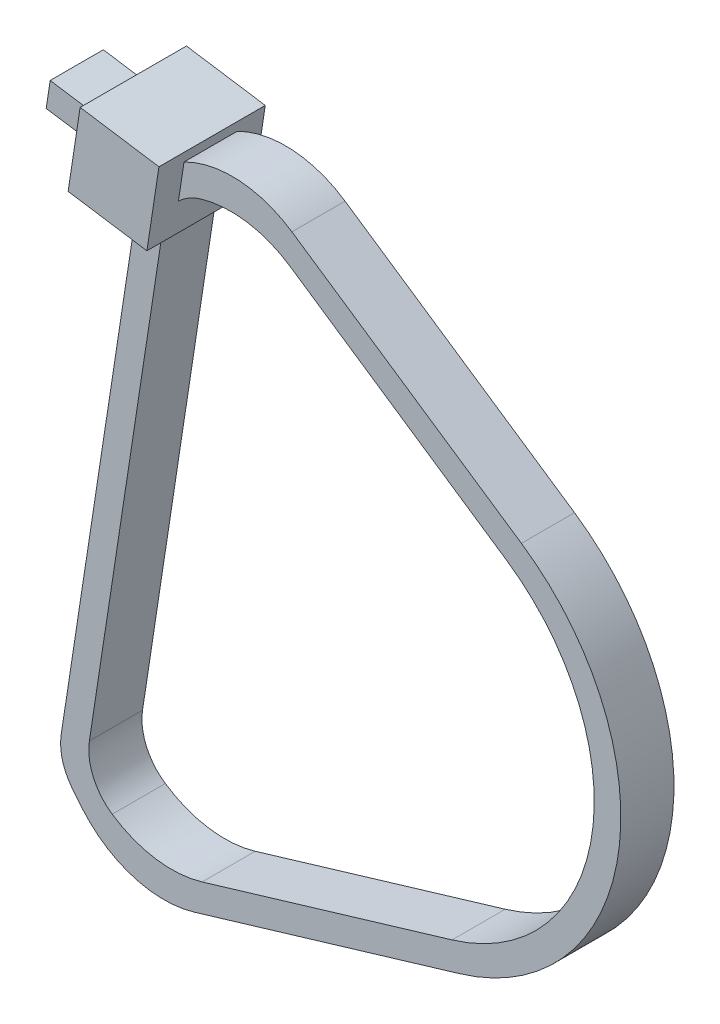
ISO-10303-21;
HEADER;
FILE_DESCRIPTION(('STEP AP214'),'2;1');
FILE_NAME('part.step','',(''),(''),'','','');
FILE_SCHEMA(('AUTOMOTIVE_DESIGN { 1 0 10303 214 1 1 1 1 }'));
ENDSEC;
DATA;
#1=APPLICATION_CONTEXT('core data for automotive mechanical design processes');
#2=APPLICATION_PROTOCOL_DEFINITION('international standard','automotive_design',2000,#1);
#3=PRODUCT_CONTEXT('',#1,'mechanical');
#4=PRODUCT('Part','Part','',(#3));
#5=PRODUCT_RELATED_PRODUCT_CATEGORY('part','',(#4));
#6=PRODUCT_DEFINITION_FORMATION('','',#4);
#7=PRODUCT_DEFINITION_CONTEXT('part definition',#1,'design');
#8=PRODUCT_DEFINITION('design','',#6,#7);
#9=PRODUCT_DEFINITION_SHAPE('','',#8);
#10=(LENGTH_UNIT() NAMED_UNIT(*) SI_UNIT(.MILLI.,.METRE.));
#11=(NAMED_UNIT(*) PLANE_ANGLE_UNIT() SI_UNIT($,.RADIAN.));
#12=(NAMED_UNIT(*) SI_UNIT($,.STERADIAN.) SOLID_ANGLE_UNIT());
#13=UNCERTAINTY_MEASURE_WITH_UNIT(LENGTH_MEASURE(1.E-05),#10,'distance_accuracy_value','');
#14=(GEOMETRIC_REPRESENTATION_CONTEXT(3) GLOBAL_UNCERTAINTY_ASSIGNED_CONTEXT((#13)) GLOBAL_UNIT_ASSIGNED_CONTEXT((#10,
#11,#12)) REPRESENTATION_CONTEXT('',''));
#15=CARTESIAN_POINT('',(0.,0.,0.));
#16=DIRECTION('',(0.,0.,1.));
#17=DIRECTION('',(1.,0.,0.));
#18=AXIS2_PLACEMENT_3D('',#15,#16,#17);
#19=CARTESIAN_POINT('',(-11.3004799617166,10.9841214502609,-2.25));
#20=DIRECTION('',(-0.988515428342357,0.151119978590279,0.));
#21=DIRECTION('',(-0.151119978590279,-0.988515428342357,0.));
#22=AXIS2_PLACEMENT_3D('',#19,#20,#21);
#23=PLANE('',#22);
#24=DIRECTION('',(0.,0.,1.));
#25=VECTOR('',#24,1.);
#26=CARTESIAN_POINT('',(-11.3004799617166,10.9841214502609,-2.25));
#27=LINE('',#26,#25);
#28=CARTESIAN_POINT('',(-11.3004799617166,10.9841214502609,-2.25));
#29=VERTEX_POINT('',#28);
#30=CARTESIAN_POINT('',(-11.3004799617166,10.9841214502609,1.75));
#31=VERTEX_POINT('',#30);
#32=EDGE_CURVE('E308',#29,#31,#27,.T.);
#33=ORIENTED_EDGE('',*,*,#32,.T.);
#34=DIRECTION('',(-0.151119978590279,-0.988515428342357,0.));
#35=VECTOR('',#34,1.);
#36=CARTESIAN_POINT('',(-11.3004799617166,10.9841214502609,1.75));
#37=LINE('',#36,#35);
#38=CARTESIAN_POINT('',(-10.8471200259457,13.949667735288,1.75));
#39=VERTEX_POINT('',#38);
#40=EDGE_CURVE('E269',#39,#31,#37,.T.);
#41=ORIENTED_EDGE('',*,*,#40,.F.);
#42=DIRECTION('',(0.,0.,1.));
#43=VECTOR('',#42,1.);
#44=CARTESIAN_POINT('',(-10.8471200259457,13.949667735288,-2.25));
#45=LINE('',#44,#43);
#46=CARTESIAN_POINT('',(-10.8471200259457,13.949667735288,-2.25));
#47=VERTEX_POINT('',#46);
#48=EDGE_CURVE('E309',#47,#39,#45,.T.);
#49=ORIENTED_EDGE('',*,*,#48,.F.);
#50=DIRECTION('',(-0.151119978590279,-0.988515428342357,0.));
#51=VECTOR('',#50,1.);
#52=CARTESIAN_POINT('',(-11.3004799617166,10.9841214502609,-2.25));
#53=LINE('',#52,#51);
#54=EDGE_CURVE('E292',#47,#29,#53,.T.);
#55=ORIENTED_EDGE('',*,*,#54,.T.);
#56=EDGE_LOOP('',(#33,#41,#49,#55));
#57=FACE_BOUND('',#56,.T.);
#58=DIRECTION('',(0.,0.,-1.));
#59=VECTOR('',#58,1.);
#60=CARTESIAN_POINT('',(-10.998240004536,12.9611523069456,-1.25));
#61=LINE('',#60,#59);
#62=CARTESIAN_POINT('',(-10.998240004536,12.9611523069456,0.75));
#63=VERTEX_POINT('',#62);
#64=CARTESIAN_POINT('',(-10.998240004536,12.9611523069456,-1.25));
#65=VERTEX_POINT('',#64);
#66=EDGE_CURVE('E804',#63,#65,#61,.T.);
#67=ORIENTED_EDGE('',*,*,#66,.F.);
#68=DIRECTION('',(0.151119978590278,0.988515428342357,0.));
#69=VECTOR('',#68,1.);
#70=CARTESIAN_POINT('',(-11.1493599831263,11.9726368786033,0.75));
#71=LINE('',#70,#69);
#72=CARTESIAN_POINT('',(-11.1493599831263,11.9726368786033,0.75));
#73=VERTEX_POINT('',#72);
#74=EDGE_CURVE('E266',#73,#63,#71,.T.);
#75=ORIENTED_EDGE('',*,*,#74,.F.);
#76=DIRECTION('',(0.,0.,1.));
#77=VECTOR('',#76,1.);
#78=CARTESIAN_POINT('',(-11.1493599831263,11.9726368786033,-1.25));
#79=LINE('',#78,#77);
#80=CARTESIAN_POINT('',(-11.1493599831263,11.9726368786033,-1.25));
#81=VERTEX_POINT('',#80);
#82=EDGE_CURVE('E262',#81,#73,#79,.T.);
#83=ORIENTED_EDGE('',*,*,#82,.F.);
#84=DIRECTION('',(-0.151119978590278,-0.988515428342357,0.));
#85=VECTOR('',#84,1.);
#86=CARTESIAN_POINT('',(-11.1493599831263,11.9726368786033,-1.25));
#87=LINE('',#86,#85);
#88=EDGE_CURVE('E800',#65,#81,#87,.T.);
#89=ORIENTED_EDGE('',*,*,#88,.F.);
#90=EDGE_LOOP('',(#67,#75,#83,#89));
#91=FACE_BOUND('',#90,.T.);
#92=ADVANCED_FACE('F39',(#57,#91),#23,.T.);
#93=CARTESIAN_POINT('',(-8.69497290703042,-7.29872013243492,0.75));
#94=DIRECTION('',(0.,0.,-1.));
#95=DIRECTION('',(-1.,0.,0.));
#96=AXIS2_PLACEMENT_3D('',#93,#94,#95);
#97=PLANE('',#96);
#98=CARTESIAN_POINT('',(-6.11720410421297,9.56314191952647,0.75));
#99=DIRECTION('',(0.,0.,1.));
#100=DIRECTION('',(1.,0.,0.));
#101=AXIS2_PLACEMENT_3D('',#98,#99,#100);
#102=CIRCLE('',#101,4.);
#103=CARTESIAN_POINT('',(-3.87804418041646,12.8776800224397,0.75));
#104=VERTEX_POINT('',#103);
#105=CARTESIAN_POINT('',(-7.93841591432612,13.1244882299412,0.75));
#106=VERTEX_POINT('',#105);
#107=EDGE_CURVE('E415',#104,#106,#102,.T.);
#108=ORIENTED_EDGE('',*,*,#107,.T.);
#109=DIRECTION('',(-0.151119978590279,-0.988515428342357,0.));
#110=VECTOR('',#109,1.);
#111=CARTESIAN_POINT('',(-11.0066029414264,-6.94532809495063,0.75));
#112=LINE('',#111,#110);
#113=CARTESIAN_POINT('',(-8.14988955376458,11.7411836713864,0.75));
#114=VERTEX_POINT('',#113);
#115=EDGE_CURVE('E334',#106,#114,#112,.T.);
#116=ORIENTED_EDGE('',*,*,#115,.T.);
#117=CARTESIAN_POINT('',(-6.74960884272515,10.3131731916311,0.75));
#118=DIRECTION('',(0.,0.,1.));
#119=DIRECTION('',(-1.,0.,0.));
#120=AXIS2_PLACEMENT_3D('',#117,#118,#119);
#121=CIRCLE('',#120,2.);
#122=CARTESIAN_POINT('',(-7.32205042245277,12.2295005743606,0.75));
#123=VERTEX_POINT('',#122);
#124=EDGE_CURVE('E349',#123,#114,#121,.T.);
#125=ORIENTED_EDGE('',*,*,#124,.F.);
#126=CARTESIAN_POINT('',(-6.17716726299753,8.39684580890161,0.75));
#127=DIRECTION('',(0.,0.,1.));
#128=DIRECTION('',(1.,0.,0.));
#129=AXIS2_PLACEMENT_3D('',#126,#127,#128);
#130=CIRCLE('',#129,4.);
#131=CARTESIAN_POINT('',(-3.93800733920104,11.7113839118149,0.75));
#132=VERTEX_POINT('',#131);
#133=EDGE_CURVE('E346',#132,#123,#130,.T.);
#134=ORIENTED_EDGE('',*,*,#133,.F.);
#135=DIRECTION('',(-0.82863452572831,0.559789980949122,0.));
#136=VECTOR('',#135,1.);
#137=CARTESIAN_POINT('',(-3.93800733920104,11.7113839118149,0.75));
#138=LINE('',#137,#136);
#139=CARTESIAN_POINT('',(4.19842485711846,6.21475894296231,0.75));
#140=VERTEX_POINT('',#139);
#141=EDGE_CURVE('E343',#140,#132,#138,.T.);
#142=ORIENTED_EDGE('',*,*,#141,.F.);
#143=CARTESIAN_POINT('',(0.,0.,0.75));
#144=DIRECTION('',(0.,0.,1.));
#145=DIRECTION('',(1.,0.,0.));
#146=AXIS2_PLACEMENT_3D('',#143,#144,#145);
#147=CIRCLE('',#146,7.50000000000001);
#148=CARTESIAN_POINT('',(2.14988746924229,-7.18526157280269,0.75));
#149=VERTEX_POINT('',#148);
#150=EDGE_CURVE('E341',#149,#140,#147,.T.);
#151=ORIENTED_EDGE('',*,*,#150,.F.);
#152=DIRECTION('',(0.958034876373692,0.28665166256564,0.));
#153=VECTOR('',#152,1.);
#154=CARTESIAN_POINT('',(-7.25713766825438,-9.99991838954302,0.75));
#155=LINE('',#154,#153);
#156=CARTESIAN_POINT('',(-7.25713766825438,-9.99991838954302,0.75));
#157=VERTEX_POINT('',#156);
#158=EDGE_CURVE('E360',#157,#149,#155,.T.);
#159=ORIENTED_EDGE('',*,*,#158,.F.);
#160=CARTESIAN_POINT('',(-8.40374431851694,-6.16777888404825,0.75));
#161=DIRECTION('',(0.,0.,1.));
#162=DIRECTION('',(-1.,0.,0.));
#163=AXIS2_PLACEMENT_3D('',#160,#161,#162);
#164=CIRCLE('',#163,4.);
#165=CARTESIAN_POINT('',(-10.6414134147123,-9.48332363807163,0.75));
#166=VERTEX_POINT('',#165);
#167=EDGE_CURVE('E357',#166,#157,#164,.T.);
#168=ORIENTED_EDGE('',*,*,#167,.F.);
#169=CARTESIAN_POINT('',(-9.52257886661464,-7.82555126105994,0.75));
#170=DIRECTION('',(0.,0.,1.));
#171=DIRECTION('',(1.,0.,0.));
#172=AXIS2_PLACEMENT_3D('',#169,#170,#171);
#173=CIRCLE('',#172,2.);
#174=CARTESIAN_POINT('',(-11.4996097232994,-7.52331130387939,0.75));
#175=VERTEX_POINT('',#174);
#176=EDGE_CURVE('E355',#175,#166,#173,.T.);
#177=ORIENTED_EDGE('',*,*,#176,.F.);
#178=DIRECTION('',(-0.151119978590279,-0.988515428342357,0.));
#179=VECTOR('',#178,1.);
#180=CARTESIAN_POINT('',(-11.4996097232994,-7.52331130387939,0.75));
#181=LINE('',#180,#179);
#182=CARTESIAN_POINT('',(-8.73033984802645,10.5912095059262,0.75));
#183=VERTEX_POINT('',#182);
#184=EDGE_CURVE('E352',#183,#175,#181,.T.);
#185=ORIENTED_EDGE('',*,*,#184,.F.);
#186=DIRECTION('',(-0.988515428342357,0.151119978590278,0.));
#187=VECTOR('',#186,1.);
#188=CARTESIAN_POINT('',(-6.02330364229356,10.1773694770058,0.75));
#189=LINE('',#188,#187);
#190=CARTESIAN_POINT('',(-9.71885527636881,10.7423294845165,0.75));
#191=VERTEX_POINT('',#190);
#192=EDGE_CURVE('E324',#183,#191,#189,.T.);
#193=ORIENTED_EDGE('',*,*,#192,.T.);
#194=DIRECTION('',(-0.151119978590279,-0.988515428342357,0.));
#195=VECTOR('',#194,1.);
#196=CARTESIAN_POINT('',(-12.559604102429,-7.83975389586432,0.75));
#197=LINE('',#196,#195);
#198=CARTESIAN_POINT('',(-12.559604102429,-7.83975389586432,0.75));
#199=VERTEX_POINT('',#198);
#200=EDGE_CURVE('E418',#191,#199,#197,.T.);
#201=ORIENTED_EDGE('',*,*,#200,.T.);
#202=CARTESIAN_POINT('',(-10.5825732457443,-8.14199385304488,0.75));
#203=DIRECTION('',(0.,0.,1.));
#204=DIRECTION('',(1.,0.,0.));
#205=AXIS2_PLACEMENT_3D('',#202,#203,#204);
#206=CIRCLE('',#205,2.);
#207=CARTESIAN_POINT('',(-12.1677088063688,-9.36156150366688,0.75));
#208=VERTEX_POINT('',#207);
#209=EDGE_CURVE('E421',#199,#208,#206,.T.);
#210=ORIENTED_EDGE('',*,*,#209,.T.);
#211=CARTESIAN_POINT('',(0.,0.,0.75));
#212=DIRECTION('',(0.,0.,1.));
#213=DIRECTION('',(1.,0.,0.));
#214=AXIS2_PLACEMENT_3D('',#211,#212,#213);
#215=CIRCLE('',#214,15.3522627447397);
#216=CARTESIAN_POINT('',(-11.7586697585007,-9.87044360168496,0.75));
#217=VERTEX_POINT('',#216);
#218=EDGE_CURVE('E423',#208,#217,#215,.T.);
#219=ORIENTED_EDGE('',*,*,#218,.T.);
#220=CARTESIAN_POINT('',(-8.69497290703042,-7.29872013243492,0.75));
#221=DIRECTION('',(0.,0.,1.));
#222=DIRECTION('',(-1.,0.,0.));
#223=AXIS2_PLACEMENT_3D('',#220,#221,#222);
#224=CIRCLE('',#223,4.00000000000001);
#225=CARTESIAN_POINT('',(-7.54836625676786,-11.1308596379297,0.75));
#226=VERTEX_POINT('',#225);
#227=EDGE_CURVE('E405',#217,#226,#224,.T.);
#228=ORIENTED_EDGE('',*,*,#227,.T.);
#229=DIRECTION('',(0.958034876373692,0.28665166256564,0.));
#230=VECTOR('',#229,1.);
#231=CARTESIAN_POINT('',(2.43653913180794,-8.14329644917638,0.75));
#232=LINE('',#231,#230);
#233=CARTESIAN_POINT('',(2.43653913180794,-8.14329644917638,0.75));
#234=VERTEX_POINT('',#233);
#235=EDGE_CURVE('E408',#226,#234,#232,.T.);
#236=ORIENTED_EDGE('',*,*,#235,.T.);
#237=CARTESIAN_POINT('',(0.,0.,0.75));
#238=DIRECTION('',(0.,0.,1.));
#239=DIRECTION('',(1.,0.,0.));
#240=AXIS2_PLACEMENT_3D('',#237,#238,#239);
#241=CIRCLE('',#240,8.50000000000001);
#242=CARTESIAN_POINT('',(4.75821483806758,7.04339346869062,0.75));
#243=VERTEX_POINT('',#242);
#244=EDGE_CURVE('E411',#234,#243,#241,.T.);
#245=ORIENTED_EDGE('',*,*,#244,.T.);
#246=DIRECTION('',(-0.828634525728307,0.559789980949127,0.));
#247=VECTOR('',#246,1.);
#248=CARTESIAN_POINT('',(4.75821483806758,7.04339346869062,0.75));
#249=LINE('',#248,#247);
#250=EDGE_CURVE('E413',#243,#104,#249,.T.);
#251=ORIENTED_EDGE('',*,*,#250,.T.);
#252=EDGE_LOOP('',(#108,#116,#125,#134,#142,#151,#159,#168,#177,#185,#193,#201,#210,#219,#228,
#236,#245,#251));
#253=FACE_BOUND('',#252,.T.);
#254=ADVANCED_FACE('F475',(#253),#97,.F.);
#255=CARTESIAN_POINT('',(-8.69497290703042,-7.29872013243492,-1.25));
#256=DIRECTION('',(0.,0.,-1.));
#257=DIRECTION('',(-1.,0.,0.));
#258=AXIS2_PLACEMENT_3D('',#255,#256,#257);
#259=PLANE('',#258);
#260=DIRECTION('',(-0.151119978590279,-0.988515428342357,0.));
#261=VECTOR('',#260,1.);
#262=CARTESIAN_POINT('',(-11.0066029414264,-6.94532809495063,-1.25));
#263=LINE('',#262,#261);
#264=CARTESIAN_POINT('',(-7.93841591432612,13.1244882299412,-1.25));
#265=VERTEX_POINT('',#264);
#266=CARTESIAN_POINT('',(-8.14988955376458,11.7411836713864,-1.25));
#267=VERTEX_POINT('',#266);
#268=EDGE_CURVE('E330',#265,#267,#263,.T.);
#269=ORIENTED_EDGE('',*,*,#268,.F.);
#270=CARTESIAN_POINT('',(-6.11720410421297,9.56314191952647,-1.25));
#271=DIRECTION('',(0.,0.,1.));
#272=DIRECTION('',(1.,0.,0.));
#273=AXIS2_PLACEMENT_3D('',#270,#271,#272);
#274=CIRCLE('',#273,4.);
#275=CARTESIAN_POINT('',(-3.87804418041646,12.8776800224397,-1.25));
#276=VERTEX_POINT('',#275);
#277=EDGE_CURVE('E434',#276,#265,#274,.T.);
#278=ORIENTED_EDGE('',*,*,#277,.F.);
#279=DIRECTION('',(-0.828634525728307,0.559789980949127,0.));
#280=VECTOR('',#279,1.);
#281=CARTESIAN_POINT('',(4.75821483806758,7.04339346869062,-1.25));
#282=LINE('',#281,#280);
#283=CARTESIAN_POINT('',(4.75821483806758,7.04339346869062,-1.25));
#284=VERTEX_POINT('',#283);
#285=EDGE_CURVE('E432',#284,#276,#282,.T.);
#286=ORIENTED_EDGE('',*,*,#285,.F.);
#287=CARTESIAN_POINT('',(0.,0.,-1.25));
#288=DIRECTION('',(0.,0.,1.));
#289=DIRECTION('',(1.,0.,0.));
#290=AXIS2_PLACEMENT_3D('',#287,#288,#289);
#291=CIRCLE('',#290,8.50000000000001);
#292=CARTESIAN_POINT('',(2.43653913180794,-8.14329644917638,-1.25));
#293=VERTEX_POINT('',#292);
#294=EDGE_CURVE('E430',#293,#284,#291,.T.);
#295=ORIENTED_EDGE('',*,*,#294,.F.);
#296=DIRECTION('',(0.958034876373692,0.28665166256564,0.));
#297=VECTOR('',#296,1.);
#298=CARTESIAN_POINT('',(2.43653913180794,-8.14329644917638,-1.25));
#299=LINE('',#298,#297);
#300=CARTESIAN_POINT('',(-7.54836625676786,-11.1308596379297,-1.25));
#301=VERTEX_POINT('',#300);
#302=EDGE_CURVE('E428',#301,#293,#299,.T.);
#303=ORIENTED_EDGE('',*,*,#302,.F.);
#304=CARTESIAN_POINT('',(-8.69497290703042,-7.29872013243492,-1.25));
#305=DIRECTION('',(0.,0.,1.));
#306=DIRECTION('',(-1.,0.,0.));
#307=AXIS2_PLACEMENT_3D('',#304,#305,#306);
#308=CIRCLE('',#307,4.00000000000001);
#309=CARTESIAN_POINT('',(-11.7586697585007,-9.87044360168496,-1.25));
#310=VERTEX_POINT('',#309);
#311=EDGE_CURVE('E404',#310,#301,#308,.T.);
#312=ORIENTED_EDGE('',*,*,#311,.F.);
#313=CARTESIAN_POINT('',(0.,0.,-1.25));
#314=DIRECTION('',(0.,0.,1.));
#315=DIRECTION('',(1.,0.,0.));
#316=AXIS2_PLACEMENT_3D('',#313,#314,#315);
#317=CIRCLE('',#316,15.3522627447397);
#318=CARTESIAN_POINT('',(-12.1677088063688,-9.36156150366688,-1.25));
#319=VERTEX_POINT('',#318);
#320=EDGE_CURVE('E409',#319,#310,#317,.T.);
#321=ORIENTED_EDGE('',*,*,#320,.F.);
#322=CARTESIAN_POINT('',(-10.5825732457443,-8.14199385304488,-1.25));
#323=DIRECTION('',(0.,0.,1.));
#324=DIRECTION('',(1.,0.,0.));
#325=AXIS2_PLACEMENT_3D('',#322,#323,#324);
#326=CIRCLE('',#325,2.);
#327=CARTESIAN_POINT('',(-12.559604102429,-7.83975389586432,-1.25));
#328=VERTEX_POINT('',#327);
#329=EDGE_CURVE('E440',#328,#319,#326,.T.);
#330=ORIENTED_EDGE('',*,*,#329,.F.);
#331=DIRECTION('',(-0.151119978590279,-0.988515428342357,0.));
#332=VECTOR('',#331,1.);
#333=CARTESIAN_POINT('',(-12.559604102429,-7.83975389586432,-1.25));
#334=LINE('',#333,#332);
#335=CARTESIAN_POINT('',(-9.71885527636881,10.7423294845165,-1.25));
#336=VERTEX_POINT('',#335);
#337=EDGE_CURVE('E437',#336,#328,#334,.T.);
#338=ORIENTED_EDGE('',*,*,#337,.F.);
#339=DIRECTION('',(-0.988515428342357,0.151119978590278,0.));
#340=VECTOR('',#339,1.);
#341=CARTESIAN_POINT('',(-6.02330364229356,10.1773694770058,-1.25));
#342=LINE('',#341,#340);
#343=CARTESIAN_POINT('',(-8.73033984802645,10.5912095059262,-1.25));
#344=VERTEX_POINT('',#343);
#345=EDGE_CURVE('E312',#344,#336,#342,.T.);
#346=ORIENTED_EDGE('',*,*,#345,.F.);
#347=DIRECTION('',(-0.151119978590279,-0.988515428342357,0.));
#348=VECTOR('',#347,1.);
#349=CARTESIAN_POINT('',(-11.4996097232994,-7.52331130387939,-1.25));
#350=LINE('',#349,#348);
#351=CARTESIAN_POINT('',(-11.4996097232994,-7.52331130387939,-1.25));
#352=VERTEX_POINT('',#351);
#353=EDGE_CURVE('E376',#344,#352,#350,.T.);
#354=ORIENTED_EDGE('',*,*,#353,.T.);
#355=CARTESIAN_POINT('',(-9.52257886661464,-7.82555126105994,-1.25));
#356=DIRECTION('',(0.,0.,1.));
#357=DIRECTION('',(1.,0.,0.));
#358=AXIS2_PLACEMENT_3D('',#355,#356,#357);
#359=CIRCLE('',#358,2.);
#360=CARTESIAN_POINT('',(-10.6414134147123,-9.48332363807163,-1.25));
#361=VERTEX_POINT('',#360);
#362=EDGE_CURVE('E379',#352,#361,#359,.T.);
#363=ORIENTED_EDGE('',*,*,#362,.T.);
#364=CARTESIAN_POINT('',(-8.40374431851694,-6.16777888404825,-1.25));
#365=DIRECTION('',(0.,0.,1.));
#366=DIRECTION('',(-1.,0.,0.));
#367=AXIS2_PLACEMENT_3D('',#364,#365,#366);
#368=CIRCLE('',#367,4.);
#369=CARTESIAN_POINT('',(-7.25713766825438,-9.99991838954301,-1.25));
#370=VERTEX_POINT('',#369);
#371=EDGE_CURVE('E382',#361,#370,#368,.T.);
#372=ORIENTED_EDGE('',*,*,#371,.T.);
#373=DIRECTION('',(0.958034876373692,0.28665166256564,0.));
#374=VECTOR('',#373,1.);
#375=CARTESIAN_POINT('',(-7.25713766825438,-9.99991838954302,-1.25));
#376=LINE('',#375,#374);
#377=CARTESIAN_POINT('',(2.1498874692423,-7.18526157280269,-1.25));
#378=VERTEX_POINT('',#377);
#379=EDGE_CURVE('E344',#370,#378,#376,.T.);
#380=ORIENTED_EDGE('',*,*,#379,.T.);
#381=CARTESIAN_POINT('',(0.,0.,-1.25));
#382=DIRECTION('',(0.,0.,1.));
#383=DIRECTION('',(1.,0.,0.));
#384=AXIS2_PLACEMENT_3D('',#381,#382,#383);
#385=CIRCLE('',#384,7.50000000000001);
#386=CARTESIAN_POINT('',(4.19842485711846,6.21475894296231,-1.25));
#387=VERTEX_POINT('',#386);
#388=EDGE_CURVE('E340',#378,#387,#385,.T.);
#389=ORIENTED_EDGE('',*,*,#388,.T.);
#390=DIRECTION('',(-0.82863452572831,0.559789980949122,0.));
#391=VECTOR('',#390,1.);
#392=CARTESIAN_POINT('',(-3.93800733920104,11.7113839118149,-1.25));
#393=LINE('',#392,#391);
#394=CARTESIAN_POINT('',(-3.93800733920104,11.7113839118149,-1.25));
#395=VERTEX_POINT('',#394);
#396=EDGE_CURVE('E365',#387,#395,#393,.T.);
#397=ORIENTED_EDGE('',*,*,#396,.T.);
#398=CARTESIAN_POINT('',(-6.17716726299753,8.39684580890161,-1.25));
#399=DIRECTION('',(0.,0.,1.));
#400=DIRECTION('',(1.,0.,0.));
#401=AXIS2_PLACEMENT_3D('',#398,#399,#400);
#402=CIRCLE('',#401,4.);
#403=CARTESIAN_POINT('',(-7.32205042245277,12.2295005743606,-1.25));
#404=VERTEX_POINT('',#403);
#405=EDGE_CURVE('E368',#395,#404,#402,.T.);
#406=ORIENTED_EDGE('',*,*,#405,.T.);
#407=CARTESIAN_POINT('',(-6.74960884272515,10.3131731916311,-1.25));
#408=DIRECTION('',(0.,0.,1.));
#409=DIRECTION('',(-1.,0.,0.));
#410=AXIS2_PLACEMENT_3D('',#407,#408,#409);
#411=CIRCLE('',#410,2.);
#412=EDGE_CURVE('E372',#404,#267,#411,.T.);
#413=ORIENTED_EDGE('',*,*,#412,.T.);
#414=EDGE_LOOP('',(#269,#278,#286,#295,#303,#312,#321,#330,#338,#346,#354,#363,#372,#380,#389,
#397,#406,#413));
#415=FACE_BOUND('',#414,.T.);
#416=ADVANCED_FACE('F488',(#415),#259,.T.);
#417=CARTESIAN_POINT('',(-8.69497290703042,-7.29872013243492,0.75));
#418=DIRECTION('',(0.,0.,-1.));
#419=DIRECTION('',(-1.,0.,0.));
#420=AXIS2_PLACEMENT_3D('',#417,#418,#419);
#421=CYLINDRICAL_SURFACE('',#420,4.00000000000001);
#422=ORIENTED_EDGE('',*,*,#311,.T.);
#423=DIRECTION('',(0.,0.,-1.));
#424=VECTOR('',#423,1.);
#425=CARTESIAN_POINT('',(-7.54836625676786,-11.1308596379297,0.75));
#426=LINE('',#425,#424);
#427=EDGE_CURVE('E460',#226,#301,#426,.T.);
#428=ORIENTED_EDGE('',*,*,#427,.F.);
#429=ORIENTED_EDGE('',*,*,#227,.F.);
#430=DIRECTION('',(0.,0.,-1.));
#431=VECTOR('',#430,1.);
#432=CARTESIAN_POINT('',(-11.7586697585007,-9.87044360168496,0.75));
#433=LINE('',#432,#431);
#434=EDGE_CURVE('E425',#217,#310,#433,.T.);
#435=ORIENTED_EDGE('',*,*,#434,.T.);
#436=EDGE_LOOP('',(#422,#428,#429,#435));
#437=FACE_BOUND('',#436,.T.);
#438=ADVANCED_FACE('F41',(#437),#421,.T.);
#439=CARTESIAN_POINT('',(2.43653913180794,-8.14329644917638,0.75));
#440=DIRECTION('',(-0.28665166256564,0.958034876373692,0.));
#441=DIRECTION('',(-0.958034876373692,-0.28665166256564,0.));
#442=AXIS2_PLACEMENT_3D('',#439,#440,#441);
#443=PLANE('',#442);
#444=ORIENTED_EDGE('',*,*,#302,.T.);
#445=DIRECTION('',(0.,0.,-1.));
#446=VECTOR('',#445,1.);
#447=CARTESIAN_POINT('',(2.43653913180794,-8.14329644917638,0.75));
#448=LINE('',#447,#446);
#449=EDGE_CURVE('E457',#234,#293,#448,.T.);
#450=ORIENTED_EDGE('',*,*,#449,.F.);
#451=ORIENTED_EDGE('',*,*,#235,.F.);
#452=ORIENTED_EDGE('',*,*,#427,.T.);
#453=EDGE_LOOP('',(#444,#450,#451,#452));
#454=FACE_BOUND('',#453,.T.);
#455=ADVANCED_FACE('F508',(#454),#443,.F.);
#456=CARTESIAN_POINT('',(0.,0.,0.75));
#457=DIRECTION('',(0.,0.,-1.));
#458=DIRECTION('',(-1.,0.,0.));
#459=AXIS2_PLACEMENT_3D('',#456,#457,#458);
#460=CYLINDRICAL_SURFACE('',#459,8.50000000000001);
#461=ORIENTED_EDGE('',*,*,#294,.T.);
#462=DIRECTION('',(0.,0.,-1.));
#463=VECTOR('',#462,1.);
#464=CARTESIAN_POINT('',(4.75821483806758,7.04339346869062,0.75));
#465=LINE('',#464,#463);
#466=EDGE_CURVE('E454',#243,#284,#465,.T.);
#467=ORIENTED_EDGE('',*,*,#466,.F.);
#468=ORIENTED_EDGE('',*,*,#244,.F.);
#469=ORIENTED_EDGE('',*,*,#449,.T.);
#470=EDGE_LOOP('',(#461,#467,#468,#469));
#471=FACE_BOUND('',#470,.T.);
#472=ADVANCED_FACE('F515',(#471),#460,.T.);
#473=CARTESIAN_POINT('',(4.75821483806758,7.04339346869062,0.75));
#474=DIRECTION('',(-0.559789980949127,-0.828634525728307,0.));
#475=DIRECTION('',(0.828634525728307,-0.559789980949127,0.));
#476=AXIS2_PLACEMENT_3D('',#473,#474,#475);
#477=PLANE('',#476);
#478=ORIENTED_EDGE('',*,*,#285,.T.);
#479=DIRECTION('',(0.,0.,-1.));
#480=VECTOR('',#479,1.);
#481=CARTESIAN_POINT('',(-3.87804418041646,12.8776800224397,0.75));
#482=LINE('',#481,#480);
#483=EDGE_CURVE('E451',#104,#276,#482,.T.);
#484=ORIENTED_EDGE('',*,*,#483,.F.);
#485=ORIENTED_EDGE('',*,*,#250,.F.);
#486=ORIENTED_EDGE('',*,*,#466,.T.);
#487=EDGE_LOOP('',(#478,#484,#485,#486));
#488=FACE_BOUND('',#487,.T.);
#489=ADVANCED_FACE('F519',(#488),#477,.F.);
#490=CARTESIAN_POINT('',(-6.11720410421297,9.56314191952647,0.75));
#491=DIRECTION('',(0.,0.,-1.));
#492=DIRECTION('',(-1.,0.,0.));
#493=AXIS2_PLACEMENT_3D('',#490,#491,#492);
#494=CYLINDRICAL_SURFACE('',#493,4.);
#495=ORIENTED_EDGE('',*,*,#277,.T.);
#496=DIRECTION('',(0.,0.,-1.));
#497=VECTOR('',#496,1.);
#498=CARTESIAN_POINT('',(-7.93841591432612,13.1244882299412,0.75));
#499=LINE('',#498,#497);
#500=EDGE_CURVE('E69',#265,#106,#499,.F.);
#501=ORIENTED_EDGE('',*,*,#500,.T.);
#502=ORIENTED_EDGE('',*,*,#107,.F.);
#503=ORIENTED_EDGE('',*,*,#483,.T.);
#504=EDGE_LOOP('',(#495,#501,#502,#503));
#505=FACE_BOUND('',#504,.T.);
#506=ADVANCED_FACE('F521',(#505),#494,.T.);
#507=CARTESIAN_POINT('',(-12.559604102429,-7.83975389586432,0.75));
#508=DIRECTION('',(0.988515428342357,-0.151119978590279,0.));
#509=DIRECTION('',(0.151119978590279,0.988515428342357,0.));
#510=AXIS2_PLACEMENT_3D('',#507,#508,#509);
#511=PLANE('',#510);
#512=ORIENTED_EDGE('',*,*,#200,.F.);
#513=DIRECTION('',(0.,0.,-1.));
#514=VECTOR('',#513,1.);
#515=CARTESIAN_POINT('',(-9.71885527636881,10.7423294845165,0.75));
#516=LINE('',#515,#514);
#517=EDGE_CURVE('E327',#191,#336,#516,.T.);
#518=ORIENTED_EDGE('',*,*,#517,.T.);
#519=ORIENTED_EDGE('',*,*,#337,.T.);
#520=DIRECTION('',(0.,0.,-1.));
#521=VECTOR('',#520,1.);
#522=CARTESIAN_POINT('',(-12.559604102429,-7.83975389586432,0.75));
#523=LINE('',#522,#521);
#524=EDGE_CURVE('E448',#199,#328,#523,.T.);
#525=ORIENTED_EDGE('',*,*,#524,.F.);
#526=EDGE_LOOP('',(#512,#518,#519,#525));
#527=FACE_BOUND('',#526,.T.);
#528=ADVANCED_FACE('F494',(#527),#511,.F.);
#529=CARTESIAN_POINT('',(-10.5825732457443,-8.14199385304488,0.75));
#530=DIRECTION('',(0.,0.,-1.));
#531=DIRECTION('',(-1.,0.,0.));
#532=AXIS2_PLACEMENT_3D('',#529,#530,#531);
#533=CYLINDRICAL_SURFACE('',#532,2.);
#534=ORIENTED_EDGE('',*,*,#329,.T.);
#535=DIRECTION('',(0.,0.,-1.));
#536=VECTOR('',#535,1.);
#537=CARTESIAN_POINT('',(-12.1677088063688,-9.36156150366688,0.75));
#538=LINE('',#537,#536);
#539=EDGE_CURVE('E445',#208,#319,#538,.T.);
#540=ORIENTED_EDGE('',*,*,#539,.F.);
#541=ORIENTED_EDGE('',*,*,#209,.F.);
#542=ORIENTED_EDGE('',*,*,#524,.T.);
#543=EDGE_LOOP('',(#534,#540,#541,#542));
#544=FACE_BOUND('',#543,.T.);
#545=ADVANCED_FACE('F497',(#544),#533,.T.);
#546=CARTESIAN_POINT('',(0.,0.,0.75));
#547=DIRECTION('',(0.,0.,-1.));
#548=DIRECTION('',(-1.,0.,0.));
#549=AXIS2_PLACEMENT_3D('',#546,#547,#548);
#550=CYLINDRICAL_SURFACE('',#549,15.3522627447397);
#551=ORIENTED_EDGE('',*,*,#320,.T.);
#552=ORIENTED_EDGE('',*,*,#434,.F.);
#553=ORIENTED_EDGE('',*,*,#218,.F.);
#554=ORIENTED_EDGE('',*,*,#539,.T.);
#555=EDGE_LOOP('',(#551,#552,#553,#554));
#556=FACE_BOUND('',#555,.T.);
#557=ADVANCED_FACE('F504',(#556),#550,.T.);
#558=CARTESIAN_POINT('',(0.,0.,0.75));
#559=DIRECTION('',(0.,0.,-1.));
#560=DIRECTION('',(-1.,0.,0.));
#561=AXIS2_PLACEMENT_3D('',#558,#559,#560);
#562=CYLINDRICAL_SURFACE('',#561,7.50000000000001);
#563=ORIENTED_EDGE('',*,*,#388,.F.);
#564=DIRECTION('',(0.,0.,-1.));
#565=VECTOR('',#564,1.);
#566=CARTESIAN_POINT('',(2.14988746924229,-7.18526157280269,0.75));
#567=LINE('',#566,#565);
#568=EDGE_CURVE('E362',#149,#378,#567,.T.);
#569=ORIENTED_EDGE('',*,*,#568,.F.);
#570=ORIENTED_EDGE('',*,*,#150,.T.);
#571=DIRECTION('',(0.,0.,-1.));
#572=VECTOR('',#571,1.);
#573=CARTESIAN_POINT('',(4.19842485711846,6.21475894296231,0.75));
#574=LINE('',#573,#572);
#575=EDGE_CURVE('E401',#140,#387,#574,.T.);
#576=ORIENTED_EDGE('',*,*,#575,.T.);
#577=EDGE_LOOP('',(#563,#569,#570,#576));
#578=FACE_BOUND('',#577,.T.);
#579=ADVANCED_FACE('F541',(#578),#562,.F.);
#580=CARTESIAN_POINT('',(-3.93800733920104,11.7113839118149,0.75));
#581=DIRECTION('',(-0.559789980949122,-0.82863452572831,0.));
#582=DIRECTION('',(0.82863452572831,-0.559789980949122,0.));
#583=AXIS2_PLACEMENT_3D('',#580,#581,#582);
#584=PLANE('',#583);
#585=ORIENTED_EDGE('',*,*,#396,.F.);
#586=ORIENTED_EDGE('',*,*,#575,.F.);
#587=ORIENTED_EDGE('',*,*,#141,.T.);
#588=DIRECTION('',(0.,0.,-1.));
#589=VECTOR('',#588,1.);
#590=CARTESIAN_POINT('',(-3.93800733920104,11.7113839118149,0.75));
#591=LINE('',#590,#589);
#592=EDGE_CURVE('E399',#132,#395,#591,.T.);
#593=ORIENTED_EDGE('',*,*,#592,.T.);
#594=EDGE_LOOP('',(#585,#586,#587,#593));
#595=FACE_BOUND('',#594,.T.);
#596=ADVANCED_FACE('F539',(#595),#584,.T.);
#597=CARTESIAN_POINT('',(-6.17716726299753,8.39684580890161,0.75));
#598=DIRECTION('',(0.,0.,-1.));
#599=DIRECTION('',(-1.,0.,0.));
#600=AXIS2_PLACEMENT_3D('',#597,#598,#599);
#601=CYLINDRICAL_SURFACE('',#600,4.);
#602=ORIENTED_EDGE('',*,*,#405,.F.);
#603=ORIENTED_EDGE('',*,*,#592,.F.);
#604=ORIENTED_EDGE('',*,*,#133,.T.);
#605=DIRECTION('',(0.,0.,-1.));
#606=VECTOR('',#605,1.);
#607=CARTESIAN_POINT('',(-7.32205042245277,12.2295005743606,0.75));
#608=LINE('',#607,#606);
#609=EDGE_CURVE('E396',#123,#404,#608,.T.);
#610=ORIENTED_EDGE('',*,*,#609,.T.);
#611=EDGE_LOOP('',(#602,#603,#604,#610));
#612=FACE_BOUND('',#611,.T.);
#613=ADVANCED_FACE('F533',(#612),#601,.F.);
#614=CARTESIAN_POINT('',(-6.74960884272515,10.3131731916311,0.75));
#615=DIRECTION('',(0.,0.,-1.));
#616=DIRECTION('',(-1.,0.,0.));
#617=AXIS2_PLACEMENT_3D('',#614,#615,#616);
#618=CYLINDRICAL_SURFACE('',#617,2.);
#619=DIRECTION('',(0.,0.,-1.));
#620=VECTOR('',#619,1.);
#621=CARTESIAN_POINT('',(-8.14988955376458,11.7411836713864,0.75));
#622=LINE('',#621,#620);
#623=EDGE_CURVE('E11',#267,#114,#622,.F.);
#624=ORIENTED_EDGE('',*,*,#623,.F.);
#625=ORIENTED_EDGE('',*,*,#412,.F.);
#626=ORIENTED_EDGE('',*,*,#609,.F.);
#627=ORIENTED_EDGE('',*,*,#124,.T.);
#628=EDGE_LOOP('',(#624,#625,#626,#627));
#629=FACE_BOUND('',#628,.T.);
#630=ADVANCED_FACE('F528',(#629),#618,.F.);
#631=CARTESIAN_POINT('',(-11.4996097232994,-7.52331130387939,0.75));
#632=DIRECTION('',(0.988515428342357,-0.151119978590279,0.));
#633=DIRECTION('',(0.151119978590279,0.988515428342357,0.));
#634=AXIS2_PLACEMENT_3D('',#631,#632,#633);
#635=PLANE('',#634);
#636=DIRECTION('',(0.,0.,-1.));
#637=VECTOR('',#636,1.);
#638=CARTESIAN_POINT('',(-8.73033984802645,10.5912095059262,0.75));
#639=LINE('',#638,#637);
#640=EDGE_CURVE('E48',#183,#344,#639,.T.);
#641=ORIENTED_EDGE('',*,*,#640,.F.);
#642=ORIENTED_EDGE('',*,*,#184,.T.);
#643=DIRECTION('',(0.,0.,-1.));
#644=VECTOR('',#643,1.);
#645=CARTESIAN_POINT('',(-11.4996097232994,-7.52331130387939,0.75));
#646=LINE('',#645,#644);
#647=EDGE_CURVE('E393',#175,#352,#646,.T.);
#648=ORIENTED_EDGE('',*,*,#647,.T.);
#649=ORIENTED_EDGE('',*,*,#353,.F.);
#650=EDGE_LOOP('',(#641,#642,#648,#649));
#651=FACE_BOUND('',#650,.T.);
#652=ADVANCED_FACE('F471',(#651),#635,.T.);
#653=CARTESIAN_POINT('',(-9.52257886661464,-7.82555126105994,0.75));
#654=DIRECTION('',(0.,0.,-1.));
#655=DIRECTION('',(-1.,0.,0.));
#656=AXIS2_PLACEMENT_3D('',#653,#654,#655);
#657=CYLINDRICAL_SURFACE('',#656,2.);
#658=ORIENTED_EDGE('',*,*,#362,.F.);
#659=ORIENTED_EDGE('',*,*,#647,.F.);
#660=ORIENTED_EDGE('',*,*,#176,.T.);
#661=DIRECTION('',(0.,0.,-1.));
#662=VECTOR('',#661,1.);
#663=CARTESIAN_POINT('',(-10.6414134147123,-9.48332363807163,0.75));
#664=LINE('',#663,#662);
#665=EDGE_CURVE('E391',#166,#361,#664,.T.);
#666=ORIENTED_EDGE('',*,*,#665,.T.);
#667=EDGE_LOOP('',(#658,#659,#660,#666));
#668=FACE_BOUND('',#667,.T.);
#669=ADVANCED_FACE('F482',(#668),#657,.F.);
#670=CARTESIAN_POINT('',(-8.40374431851694,-6.16777888404825,0.75));
#671=DIRECTION('',(0.,0.,-1.));
#672=DIRECTION('',(-1.,0.,0.));
#673=AXIS2_PLACEMENT_3D('',#670,#671,#672);
#674=CYLINDRICAL_SURFACE('',#673,4.);
#675=ORIENTED_EDGE('',*,*,#371,.F.);
#676=ORIENTED_EDGE('',*,*,#665,.F.);
#677=ORIENTED_EDGE('',*,*,#167,.T.);
#678=DIRECTION('',(0.,0.,-1.));
#679=VECTOR('',#678,1.);
#680=CARTESIAN_POINT('',(-7.25713766825438,-9.99991838954301,0.75));
#681=LINE('',#680,#679);
#682=EDGE_CURVE('E389',#157,#370,#681,.T.);
#683=ORIENTED_EDGE('',*,*,#682,.T.);
#684=EDGE_LOOP('',(#675,#676,#677,#683));
#685=FACE_BOUND('',#684,.T.);
#686=ADVANCED_FACE('F485',(#685),#674,.F.);
#687=CARTESIAN_POINT('',(-7.25713766825438,-9.99991838954302,0.75));
#688=DIRECTION('',(-0.28665166256564,0.958034876373692,0.));
#689=DIRECTION('',(-0.958034876373692,-0.28665166256564,0.));
#690=AXIS2_PLACEMENT_3D('',#687,#688,#689);
#691=PLANE('',#690);
#692=ORIENTED_EDGE('',*,*,#379,.F.);
#693=ORIENTED_EDGE('',*,*,#682,.F.);
#694=ORIENTED_EDGE('',*,*,#158,.T.);
#695=ORIENTED_EDGE('',*,*,#568,.T.);
#696=EDGE_LOOP('',(#692,#693,#694,#695));
#697=FACE_BOUND('',#696,.T.);
#698=ADVANCED_FACE('F544',(#697),#691,.T.);
#699=CARTESIAN_POINT('',(-8.33493367668951,10.5307615144901,-2.25));
#700=DIRECTION('',(0.988515428342357,-0.151119978590279,0.));
#701=DIRECTION('',(0.151119978590279,0.988515428342357,0.));
#702=AXIS2_PLACEMENT_3D('',#699,#700,#701);
#703=PLANE('',#702);
#704=DIRECTION('',(0.,0.,1.));
#705=VECTOR('',#704,1.);
#706=CARTESIAN_POINT('',(-7.88157374091867,13.4963077995172,-2.25));
#707=LINE('',#706,#705);
#708=CARTESIAN_POINT('',(-7.88157374091867,13.4963077995172,-2.25));
#709=VERTEX_POINT('',#708);
#710=CARTESIAN_POINT('',(-7.88157374091867,13.4963077995172,1.75));
#711=VERTEX_POINT('',#710);
#712=EDGE_CURVE('E313',#709,#711,#707,.T.);
#713=ORIENTED_EDGE('',*,*,#712,.T.);
#714=DIRECTION('',(0.151119978590279,0.988515428342357,0.));
#715=VECTOR('',#714,1.);
#716=CARTESIAN_POINT('',(-8.33493367668951,10.5307615144901,1.75));
#717=LINE('',#716,#715);
#718=CARTESIAN_POINT('',(-8.33493367668951,10.5307615144901,1.75));
#719=VERTEX_POINT('',#718);
#720=EDGE_CURVE('E284',#719,#711,#717,.T.);
#721=ORIENTED_EDGE('',*,*,#720,.F.);
#722=DIRECTION('',(0.,0.,1.));
#723=VECTOR('',#722,1.);
#724=CARTESIAN_POINT('',(-8.33493367668951,10.5307615144901,-2.25));
#725=LINE('',#724,#723);
#726=CARTESIAN_POINT('',(-8.33493367668951,10.5307615144901,-2.25));
#727=VERTEX_POINT('',#726);
#728=EDGE_CURVE('E316',#727,#719,#725,.T.);
#729=ORIENTED_EDGE('',*,*,#728,.F.);
#730=DIRECTION('',(0.151119978590279,0.988515428342357,0.));
#731=VECTOR('',#730,1.);
#732=CARTESIAN_POINT('',(-8.33493367668951,10.5307615144901,-2.25));
#733=LINE('',#732,#731);
#734=EDGE_CURVE('E300',#727,#709,#733,.T.);
#735=ORIENTED_EDGE('',*,*,#734,.T.);
#736=EDGE_LOOP('',(#713,#721,#729,#735));
#737=FACE_BOUND('',#736,.T.);
#738=ORIENTED_EDGE('',*,*,#500,.F.);
#739=ORIENTED_EDGE('',*,*,#268,.T.);
#740=ORIENTED_EDGE('',*,*,#623,.T.);
#741=ORIENTED_EDGE('',*,*,#115,.F.);
#742=EDGE_LOOP('',(#738,#739,#740,#741));
#743=FACE_BOUND('',#742,.T.);
#744=ADVANCED_FACE('F525',(#737,#743),#703,.T.);
#745=CARTESIAN_POINT('',(-8.33493367668951,10.5307615144901,-2.25));
#746=DIRECTION('',(-0.151119978590278,-0.988515428342357,0.));
#747=DIRECTION('',(0.988515428342357,-0.151119978590278,0.));
#748=AXIS2_PLACEMENT_3D('',#745,#746,#747);
#749=PLANE('',#748);
#750=ORIENTED_EDGE('',*,*,#728,.T.);
#751=DIRECTION('',(0.988515428342357,-0.151119978590278,0.));
#752=VECTOR('',#751,1.);
#753=CARTESIAN_POINT('',(-8.33493367668951,10.5307615144901,1.75));
#754=LINE('',#753,#752);
#755=EDGE_CURVE('E275',#31,#719,#754,.T.);
#756=ORIENTED_EDGE('',*,*,#755,.F.);
#757=ORIENTED_EDGE('',*,*,#32,.F.);
#758=DIRECTION('',(0.988515428342357,-0.151119978590278,0.));
#759=VECTOR('',#758,1.);
#760=CARTESIAN_POINT('',(-8.33493367668951,10.5307615144901,-2.25));
#761=LINE('',#760,#759);
#762=EDGE_CURVE('E296',#29,#727,#761,.T.);
#763=ORIENTED_EDGE('',*,*,#762,.T.);
#764=EDGE_LOOP('',(#750,#756,#757,#763));
#765=FACE_BOUND('',#764,.T.);
#766=ORIENTED_EDGE('',*,*,#517,.F.);
#767=ORIENTED_EDGE('',*,*,#192,.F.);
#768=ORIENTED_EDGE('',*,*,#640,.T.);
#769=ORIENTED_EDGE('',*,*,#345,.T.);
#770=EDGE_LOOP('',(#766,#767,#768,#769));
#771=FACE_BOUND('',#770,.T.);
#772=ADVANCED_FACE('F467',(#765,#771),#749,.T.);
#773=CARTESIAN_POINT('',(-7.88157374091867,13.4963077995172,-2.25));
#774=DIRECTION('',(0.151119978590279,0.988515428342357,0.));
#775=DIRECTION('',(-0.988515428342357,0.151119978590279,0.));
#776=AXIS2_PLACEMENT_3D('',#773,#774,#775);
#777=PLANE('',#776);
#778=ORIENTED_EDGE('',*,*,#48,.T.);
#779=DIRECTION('',(-0.988515428342357,0.151119978590279,0.));
#780=VECTOR('',#779,1.);
#781=CARTESIAN_POINT('',(-7.88157374091867,13.4963077995172,1.75));
#782=LINE('',#781,#780);
#783=EDGE_CURVE('E288',#711,#39,#782,.T.);
#784=ORIENTED_EDGE('',*,*,#783,.F.);
#785=ORIENTED_EDGE('',*,*,#712,.F.);
#786=DIRECTION('',(-0.988515428342357,0.151119978590279,0.));
#787=VECTOR('',#786,1.);
#788=CARTESIAN_POINT('',(-7.88157374091867,13.4963077995172,-2.25));
#789=LINE('',#788,#787);
#790=EDGE_CURVE('E304',#709,#47,#789,.T.);
#791=ORIENTED_EDGE('',*,*,#790,.T.);
#792=EDGE_LOOP('',(#778,#784,#785,#791));
#793=FACE_BOUND('',#792,.T.);
#794=ADVANCED_FACE('F564',(#793),#777,.T.);
#795=CARTESIAN_POINT('',(0.,0.,-2.25));
#796=DIRECTION('',(0.,0.,1.));
#797=DIRECTION('',(1.,0.,0.));
#798=AXIS2_PLACEMENT_3D('',#795,#796,#797);
#799=PLANE('',#798);
#800=ORIENTED_EDGE('',*,*,#54,.F.);
#801=ORIENTED_EDGE('',*,*,#790,.F.);
#802=ORIENTED_EDGE('',*,*,#734,.F.);
#803=ORIENTED_EDGE('',*,*,#762,.F.);
#804=EDGE_LOOP('',(#800,#801,#802,#803));
#805=FACE_BOUND('',#804,.T.);
#806=ADVANCED_FACE('F569',(#805),#799,.F.);
#807=CARTESIAN_POINT('',(0.,0.,1.75));
#808=DIRECTION('',(0.,0.,1.));
#809=DIRECTION('',(1.,0.,0.));
#810=AXIS2_PLACEMENT_3D('',#807,#808,#809);
#811=PLANE('',#810);
#812=ORIENTED_EDGE('',*,*,#40,.T.);
#813=ORIENTED_EDGE('',*,*,#755,.T.);
#814=ORIENTED_EDGE('',*,*,#720,.T.);
#815=ORIENTED_EDGE('',*,*,#783,.T.);
#816=EDGE_LOOP('',(#812,#813,#814,#815));
#817=FACE_BOUND('',#816,.T.);
#818=ADVANCED_FACE('F573',(#817),#811,.T.);
#819=CARTESIAN_POINT('',(-13.126390839811,12.2748768357838,0.75));
#820=DIRECTION('',(0.,0.,-1.));
#821=DIRECTION('',(-1.,0.,0.));
#822=AXIS2_PLACEMENT_3D('',#819,#820,#821);
#823=PLANE('',#822);
#824=ORIENTED_EDGE('',*,*,#74,.T.);
#825=DIRECTION('',(0.988515428342357,-0.151119978590279,0.));
#826=VECTOR('',#825,1.);
#827=CARTESIAN_POINT('',(-12.9752708612207,13.2633922641262,0.75));
#828=LINE('',#827,#826);
#829=CARTESIAN_POINT('',(-12.9752708612207,13.2633922641262,0.75));
#830=VERTEX_POINT('',#829);
#831=EDGE_CURVE('E245',#830,#63,#828,.T.);
#832=ORIENTED_EDGE('',*,*,#831,.F.);
#833=DIRECTION('',(0.151119978590278,0.988515428342357,0.));
#834=VECTOR('',#833,1.);
#835=CARTESIAN_POINT('',(-13.126390839811,12.2748768357838,0.75));
#836=LINE('',#835,#834);
#837=CARTESIAN_POINT('',(-13.126390839811,12.2748768357838,0.75));
#838=VERTEX_POINT('',#837);
#839=EDGE_CURVE('E253',#838,#830,#836,.T.);
#840=ORIENTED_EDGE('',*,*,#839,.F.);
#841=DIRECTION('',(0.988515428342357,-0.151119978590279,0.));
#842=VECTOR('',#841,1.);
#843=CARTESIAN_POINT('',(-13.126390839811,12.2748768357838,0.75));
#844=LINE('',#843,#842);
#845=EDGE_CURVE('E797',#838,#73,#844,.T.);
#846=ORIENTED_EDGE('',*,*,#845,.T.);
#847=EDGE_LOOP('',(#824,#832,#840,#846));
#848=FACE_BOUND('',#847,.T.);
#849=ADVANCED_FACE('F264',(#848),#823,.F.);
#850=CARTESIAN_POINT('',(-12.9752708612207,13.2633922641262,-1.25));
#851=DIRECTION('',(-0.151119978590279,-0.988515428342357,0.));
#852=DIRECTION('',(0.988515428342357,-0.151119978590279,0.));
#853=AXIS2_PLACEMENT_3D('',#850,#851,#852);
#854=PLANE('',#853);
#855=ORIENTED_EDGE('',*,*,#66,.T.);
#856=DIRECTION('',(0.988515428342357,-0.151119978590279,0.));
#857=VECTOR('',#856,1.);
#858=CARTESIAN_POINT('',(-12.9752708612207,13.2633922641262,-1.25));
#859=LINE('',#858,#857);
#860=CARTESIAN_POINT('',(-12.9752708612207,13.2633922641262,-1.25));
#861=VERTEX_POINT('',#860);
#862=EDGE_CURVE('E248',#861,#65,#859,.T.);
#863=ORIENTED_EDGE('',*,*,#862,.F.);
#864=DIRECTION('',(0.,0.,-1.));
#865=VECTOR('',#864,1.);
#866=CARTESIAN_POINT('',(-12.9752708612207,13.2633922641262,-1.25));
#867=LINE('',#866,#865);
#868=EDGE_CURVE('E241',#830,#861,#867,.T.);
#869=ORIENTED_EDGE('',*,*,#868,.F.);
#870=ORIENTED_EDGE('',*,*,#831,.T.);
#871=EDGE_LOOP('',(#855,#863,#869,#870));
#872=FACE_BOUND('',#871,.T.);
#873=ADVANCED_FACE('F243',(#872),#854,.F.);
#874=CARTESIAN_POINT('',(-13.126390839811,12.2748768357838,-1.25));
#875=DIRECTION('',(0.,0.,1.));
#876=DIRECTION('',(1.,0.,0.));
#877=AXIS2_PLACEMENT_3D('',#874,#875,#876);
#878=PLANE('',#877);
#879=ORIENTED_EDGE('',*,*,#88,.T.);
#880=DIRECTION('',(0.988515428342357,-0.151119978590279,0.));
#881=VECTOR('',#880,1.);
#882=CARTESIAN_POINT('',(-13.126390839811,12.2748768357838,-1.25));
#883=LINE('',#882,#881);
#884=CARTESIAN_POINT('',(-13.126390839811,12.2748768357838,-1.25));
#885=VERTEX_POINT('',#884);
#886=EDGE_CURVE('E58',#885,#81,#883,.T.);
#887=ORIENTED_EDGE('',*,*,#886,.F.);
#888=DIRECTION('',(-0.151119978590278,-0.988515428342357,0.));
#889=VECTOR('',#888,1.);
#890=CARTESIAN_POINT('',(-13.126390839811,12.2748768357838,-1.25));
#891=LINE('',#890,#889);
#892=EDGE_CURVE('E252',#861,#885,#891,.T.);
#893=ORIENTED_EDGE('',*,*,#892,.F.);
#894=ORIENTED_EDGE('',*,*,#862,.T.);
#895=EDGE_LOOP('',(#879,#887,#893,#894));
#896=FACE_BOUND('',#895,.T.);
#897=ADVANCED_FACE('F582',(#896),#878,.F.);
#898=CARTESIAN_POINT('',(-13.126390839811,12.2748768357838,-1.25));
#899=DIRECTION('',(0.151119978590279,0.988515428342357,0.));
#900=DIRECTION('',(-0.988515428342357,0.151119978590279,0.));
#901=AXIS2_PLACEMENT_3D('',#898,#899,#900);
#902=PLANE('',#901);
#903=ORIENTED_EDGE('',*,*,#82,.T.);
#904=ORIENTED_EDGE('',*,*,#845,.F.);
#905=DIRECTION('',(0.,0.,1.));
#906=VECTOR('',#905,1.);
#907=CARTESIAN_POINT('',(-13.126390839811,12.2748768357838,-1.25));
#908=LINE('',#907,#906);
#909=EDGE_CURVE('E257',#885,#838,#908,.T.);
#910=ORIENTED_EDGE('',*,*,#909,.F.);
#911=ORIENTED_EDGE('',*,*,#886,.T.);
#912=EDGE_LOOP('',(#903,#904,#910,#911));
#913=FACE_BOUND('',#912,.T.);
#914=ADVANCED_FACE('F585',(#913),#902,.F.);
#915=CARTESIAN_POINT('',(-14.6602956817295,2.24120282398143,0.));
#916=DIRECTION('',(0.988515428342357,-0.151119978590278,0.));
#917=DIRECTION('',(0.151119978590278,0.988515428342357,0.));
#918=AXIS2_PLACEMENT_3D('',#915,#916,#917);
#919=PLANE('',#918);
#920=ORIENTED_EDGE('',*,*,#839,.T.);
#921=ORIENTED_EDGE('',*,*,#868,.T.);
#922=ORIENTED_EDGE('',*,*,#892,.T.);
#923=ORIENTED_EDGE('',*,*,#909,.T.);
#924=EDGE_LOOP('',(#920,#921,#922,#923));
#925=FACE_BOUND('',#924,.T.);
#926=ADVANCED_FACE('F256',(#925),#919,.F.);
#927=CLOSED_SHELL('',(#92,#254,#416,#438,#455,#472,#489,#506,#528,#545,#557,#579,#596,#613,#630,
#652,#669,#686,#698,#744,#772,#794,#806,#818,#849,#873,#897,#914,#926));
#928=MANIFOLD_SOLID_BREP('B2',#927);
#929=ADVANCED_BREP_SHAPE_REPRESENTATION('',(#18,#928),#14);
#930=SHAPE_DEFINITION_REPRESENTATION(#9,#929);
ENDSEC;
END-ISO-10303-21;
